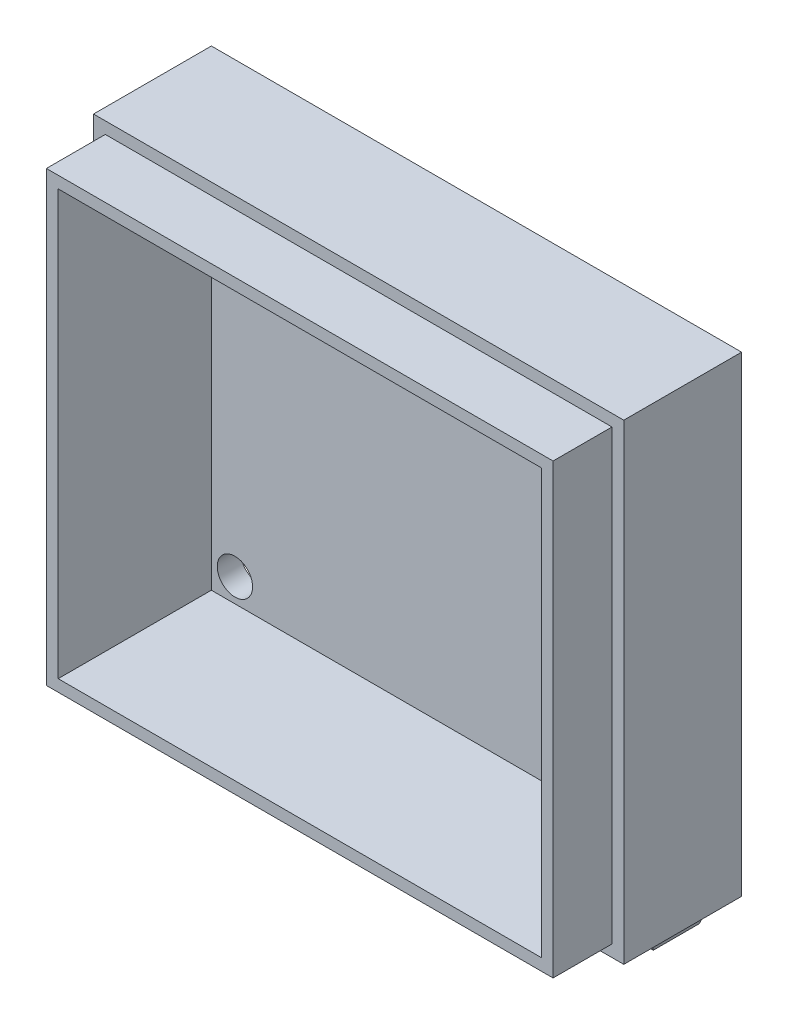
ISO-10303-21;
HEADER;
FILE_DESCRIPTION(('STEP AP214'),'2;1');
FILE_NAME('part.step','',(''),(''),'','','');
FILE_SCHEMA(('AUTOMOTIVE_DESIGN { 1 0 10303 214 1 1 1 1 }'));
ENDSEC;
DATA;
#1=APPLICATION_CONTEXT('core data for automotive mechanical design processes');
#2=APPLICATION_PROTOCOL_DEFINITION('international standard','automotive_design',2000,#1);
#3=PRODUCT_CONTEXT('',#1,'mechanical');
#4=PRODUCT('Part','Part','',(#3));
#5=PRODUCT_RELATED_PRODUCT_CATEGORY('part','',(#4));
#6=PRODUCT_DEFINITION_FORMATION('','',#4);
#7=PRODUCT_DEFINITION_CONTEXT('part definition',#1,'design');
#8=PRODUCT_DEFINITION('design','',#6,#7);
#9=PRODUCT_DEFINITION_SHAPE('','',#8);
#10=(LENGTH_UNIT() NAMED_UNIT(*) SI_UNIT(.MILLI.,.METRE.));
#11=(NAMED_UNIT(*) PLANE_ANGLE_UNIT() SI_UNIT($,.RADIAN.));
#12=(NAMED_UNIT(*) SI_UNIT($,.STERADIAN.) SOLID_ANGLE_UNIT());
#13=UNCERTAINTY_MEASURE_WITH_UNIT(LENGTH_MEASURE(1.E-05),#10,'distance_accuracy_value','');
#14=(GEOMETRIC_REPRESENTATION_CONTEXT(3) GLOBAL_UNCERTAINTY_ASSIGNED_CONTEXT((#13)) GLOBAL_UNIT_ASSIGNED_CONTEXT((#10,
#11,#12)) REPRESENTATION_CONTEXT('',''));
#15=CARTESIAN_POINT('',(0.,0.,0.));
#16=DIRECTION('',(0.,0.,1.));
#17=DIRECTION('',(1.,0.,0.));
#18=AXIS2_PLACEMENT_3D('',#15,#16,#17);
#19=CARTESIAN_POINT('',(-45.,-40.,30.));
#20=DIRECTION('',(0.,1.,0.));
#21=DIRECTION('',(0.,0.,1.));
#22=AXIS2_PLACEMENT_3D('',#19,#20,#21);
#23=PLANE('',#22);
#24=DIRECTION('',(0.,0.,-1.));
#25=VECTOR('',#24,1.);
#26=CARTESIAN_POINT('',(-42.5,-40.,12.5));
#27=LINE('',#26,#25);
#28=CARTESIAN_POINT('',(-42.5,-40.,12.5));
#29=VERTEX_POINT('',#28);
#30=CARTESIAN_POINT('',(-42.5,-40.,2.5));
#31=VERTEX_POINT('',#30);
#32=EDGE_CURVE('E254',#29,#31,#27,.T.);
#33=ORIENTED_EDGE('',*,*,#32,.F.);
#34=DIRECTION('',(-1.,0.,0.));
#35=VECTOR('',#34,1.);
#36=CARTESIAN_POINT('',(-42.5,-40.,12.5));
#37=LINE('',#36,#35);
#38=CARTESIAN_POINT('',(-35.5,-40.,12.5));
#39=VERTEX_POINT('',#38);
#40=EDGE_CURVE('E267',#39,#29,#37,.T.);
#41=ORIENTED_EDGE('',*,*,#40,.F.);
#42=DIRECTION('',(0.,0.,1.));
#43=VECTOR('',#42,1.);
#44=CARTESIAN_POINT('',(-35.5,-40.,12.5));
#45=LINE('',#44,#43);
#46=CARTESIAN_POINT('',(-35.5,-40.,2.5));
#47=VERTEX_POINT('',#46);
#48=EDGE_CURVE('E263',#47,#39,#45,.T.);
#49=ORIENTED_EDGE('',*,*,#48,.F.);
#50=DIRECTION('',(1.,0.,0.));
#51=VECTOR('',#50,1.);
#52=CARTESIAN_POINT('',(-42.5,-40.,2.5));
#53=LINE('',#52,#51);
#54=EDGE_CURVE('E258',#31,#47,#53,.T.);
#55=ORIENTED_EDGE('',*,*,#54,.F.);
#56=EDGE_LOOP('',(#33,#41,#49,#55));
#57=FACE_BOUND('',#56,.T.);
#58=DIRECTION('',(0.,0.,-1.));
#59=VECTOR('',#58,1.);
#60=CARTESIAN_POINT('',(35.5,-40.,12.5));
#61=LINE('',#60,#59);
#62=CARTESIAN_POINT('',(35.5,-40.,12.5));
#63=VERTEX_POINT('',#62);
#64=CARTESIAN_POINT('',(35.5,-40.,2.5));
#65=VERTEX_POINT('',#64);
#66=EDGE_CURVE('E259',#63,#65,#61,.T.);
#67=ORIENTED_EDGE('',*,*,#66,.F.);
#68=DIRECTION('',(-1.,0.,0.));
#69=VECTOR('',#68,1.);
#70=CARTESIAN_POINT('',(35.5,-40.,12.5));
#71=LINE('',#70,#69);
#72=CARTESIAN_POINT('',(42.5,-40.,12.5));
#73=VERTEX_POINT('',#72);
#74=EDGE_CURVE('E315',#73,#63,#71,.T.);
#75=ORIENTED_EDGE('',*,*,#74,.F.);
#76=DIRECTION('',(0.,0.,1.));
#77=VECTOR('',#76,1.);
#78=CARTESIAN_POINT('',(42.5,-40.,12.5));
#79=LINE('',#78,#77);
#80=CARTESIAN_POINT('',(42.5,-40.,2.5));
#81=VERTEX_POINT('',#80);
#82=EDGE_CURVE('E333',#81,#73,#79,.T.);
#83=ORIENTED_EDGE('',*,*,#82,.F.);
#84=DIRECTION('',(1.,0.,0.));
#85=VECTOR('',#84,1.);
#86=CARTESIAN_POINT('',(35.5,-40.,2.5));
#87=LINE('',#86,#85);
#88=EDGE_CURVE('E337',#65,#81,#87,.T.);
#89=ORIENTED_EDGE('',*,*,#88,.F.);
#90=EDGE_LOOP('',(#67,#75,#83,#89));
#91=FACE_BOUND('',#90,.T.);
#92=DIRECTION('',(1.,0.,0.));
#93=VECTOR('',#92,1.);
#94=CARTESIAN_POINT('',(-45.,-40.,20.));
#95=LINE('',#94,#93);
#96=CARTESIAN_POINT('',(-45.,-40.,20.));
#97=VERTEX_POINT('',#96);
#98=CARTESIAN_POINT('',(45.,-40.,20.));
#99=VERTEX_POINT('',#98);
#100=EDGE_CURVE('E229',#97,#99,#95,.T.);
#101=ORIENTED_EDGE('',*,*,#100,.F.);
#102=DIRECTION('',(0.,0.,-1.));
#103=VECTOR('',#102,1.);
#104=CARTESIAN_POINT('',(-45.,-40.,30.));
#105=LINE('',#104,#103);
#106=CARTESIAN_POINT('',(-45.,-40.,0.));
#107=VERTEX_POINT('',#106);
#108=EDGE_CURVE('E404',#97,#107,#105,.T.);
#109=ORIENTED_EDGE('',*,*,#108,.T.);
#110=DIRECTION('',(1.,0.,0.));
#111=VECTOR('',#110,1.);
#112=CARTESIAN_POINT('',(-45.,-40.,0.));
#113=LINE('',#112,#111);
#114=CARTESIAN_POINT('',(45.,-40.,0.));
#115=VERTEX_POINT('',#114);
#116=EDGE_CURVE('E397',#107,#115,#113,.T.);
#117=ORIENTED_EDGE('',*,*,#116,.T.);
#118=DIRECTION('',(0.,0.,-1.));
#119=VECTOR('',#118,1.);
#120=CARTESIAN_POINT('',(45.,-40.,30.));
#121=LINE('',#120,#119);
#122=EDGE_CURVE('E401',#99,#115,#121,.T.);
#123=ORIENTED_EDGE('',*,*,#122,.F.);
#124=EDGE_LOOP('',(#101,#109,#117,#123));
#125=FACE_BOUND('',#124,.T.);
#126=ADVANCED_FACE('F45',(#57,#91,#125),#23,.F.);
#127=CARTESIAN_POINT('',(0.,0.,30.));
#128=DIRECTION('',(0.,0.,-1.));
#129=DIRECTION('',(-1.,0.,0.));
#130=AXIS2_PLACEMENT_3D('',#127,#128,#129);
#131=PLANE('',#130);
#132=DIRECTION('',(0.,1.,0.));
#133=VECTOR('',#132,1.);
#134=CARTESIAN_POINT('',(41.,0.,30.));
#135=LINE('',#134,#133);
#136=CARTESIAN_POINT('',(41.,-36.,30.));
#137=VERTEX_POINT('',#136);
#138=CARTESIAN_POINT('',(41.,36.,30.));
#139=VERTEX_POINT('',#138);
#140=EDGE_CURVE('E374',#137,#139,#135,.T.);
#141=ORIENTED_EDGE('',*,*,#140,.F.);
#142=DIRECTION('',(1.,0.,0.));
#143=VECTOR('',#142,1.);
#144=CARTESIAN_POINT('',(0.,-36.,30.));
#145=LINE('',#144,#143);
#146=CARTESIAN_POINT('',(-41.,-36.,30.));
#147=VERTEX_POINT('',#146);
#148=EDGE_CURVE('E359',#147,#137,#145,.T.);
#149=ORIENTED_EDGE('',*,*,#148,.F.);
#150=DIRECTION('',(0.,-1.,0.));
#151=VECTOR('',#150,1.);
#152=CARTESIAN_POINT('',(-41.,0.,30.));
#153=LINE('',#152,#151);
#154=CARTESIAN_POINT('',(-41.,36.,30.));
#155=VERTEX_POINT('',#154);
#156=EDGE_CURVE('E380',#155,#147,#153,.T.);
#157=ORIENTED_EDGE('',*,*,#156,.F.);
#158=DIRECTION('',(-1.,0.,0.));
#159=VECTOR('',#158,1.);
#160=CARTESIAN_POINT('',(0.,36.,30.));
#161=LINE('',#160,#159);
#162=EDGE_CURVE('E377',#139,#155,#161,.T.);
#163=ORIENTED_EDGE('',*,*,#162,.F.);
#164=EDGE_LOOP('',(#141,#149,#157,#163));
#165=FACE_BOUND('',#164,.T.);
#166=DIRECTION('',(1.,0.,0.));
#167=VECTOR('',#166,1.);
#168=CARTESIAN_POINT('',(-43.,-38.,30.));
#169=LINE('',#168,#167);
#170=CARTESIAN_POINT('',(-43.,-38.,30.));
#171=VERTEX_POINT('',#170);
#172=CARTESIAN_POINT('',(43.,-38.,30.));
#173=VERTEX_POINT('',#172);
#174=EDGE_CURVE('E220',#171,#173,#169,.T.);
#175=ORIENTED_EDGE('',*,*,#174,.T.);
#176=DIRECTION('',(0.,1.,0.));
#177=VECTOR('',#176,1.);
#178=CARTESIAN_POINT('',(43.,-38.,30.));
#179=LINE('',#178,#177);
#180=CARTESIAN_POINT('',(43.,38.,30.));
#181=VERTEX_POINT('',#180);
#182=EDGE_CURVE('E188',#173,#181,#179,.T.);
#183=ORIENTED_EDGE('',*,*,#182,.T.);
#184=DIRECTION('',(-1.,0.,0.));
#185=VECTOR('',#184,1.);
#186=CARTESIAN_POINT('',(43.,38.,30.));
#187=LINE('',#186,#185);
#188=CARTESIAN_POINT('',(-43.,38.,30.));
#189=VERTEX_POINT('',#188);
#190=EDGE_CURVE('E61',#181,#189,#187,.T.);
#191=ORIENTED_EDGE('',*,*,#190,.T.);
#192=DIRECTION('',(0.,-1.,0.));
#193=VECTOR('',#192,1.);
#194=CARTESIAN_POINT('',(-43.,38.,30.));
#195=LINE('',#194,#193);
#196=EDGE_CURVE('E210',#189,#171,#195,.T.);
#197=ORIENTED_EDGE('',*,*,#196,.T.);
#198=EDGE_LOOP('',(#175,#183,#191,#197));
#199=FACE_BOUND('',#198,.T.);
#200=ADVANCED_FACE('F426',(#165,#199),#131,.F.);
#201=CARTESIAN_POINT('',(45.,-40.,30.));
#202=DIRECTION('',(-1.,0.,0.));
#203=DIRECTION('',(0.,0.,1.));
#204=AXIS2_PLACEMENT_3D('',#201,#202,#203);
#205=PLANE('',#204);
#206=DIRECTION('',(0.,1.,0.));
#207=VECTOR('',#206,1.);
#208=CARTESIAN_POINT('',(45.,-40.,20.));
#209=LINE('',#208,#207);
#210=CARTESIAN_POINT('',(45.,40.,20.));
#211=VERTEX_POINT('',#210);
#212=EDGE_CURVE('E237',#99,#211,#209,.T.);
#213=ORIENTED_EDGE('',*,*,#212,.F.);
#214=ORIENTED_EDGE('',*,*,#122,.T.);
#215=DIRECTION('',(0.,1.,0.));
#216=VECTOR('',#215,1.);
#217=CARTESIAN_POINT('',(45.,-40.,0.));
#218=LINE('',#217,#216);
#219=CARTESIAN_POINT('',(45.,40.,0.));
#220=VERTEX_POINT('',#219);
#221=EDGE_CURVE('E352',#115,#220,#218,.T.);
#222=ORIENTED_EDGE('',*,*,#221,.T.);
#223=DIRECTION('',(0.,0.,-1.));
#224=VECTOR('',#223,1.);
#225=CARTESIAN_POINT('',(45.,40.,30.));
#226=LINE('',#225,#224);
#227=EDGE_CURVE('E11',#211,#220,#226,.T.);
#228=ORIENTED_EDGE('',*,*,#227,.F.);
#229=EDGE_LOOP('',(#213,#214,#222,#228));
#230=FACE_BOUND('',#229,.T.);
#231=ADVANCED_FACE('F47',(#230),#205,.F.);
#232=CARTESIAN_POINT('',(-45.,40.,30.));
#233=DIRECTION('',(0.,-1.,0.));
#234=DIRECTION('',(0.,0.,-1.));
#235=AXIS2_PLACEMENT_3D('',#232,#233,#234);
#236=PLANE('',#235);
#237=DIRECTION('',(-1.,0.,0.));
#238=VECTOR('',#237,1.);
#239=CARTESIAN_POINT('',(45.,40.,20.));
#240=LINE('',#239,#238);
#241=CARTESIAN_POINT('',(-45.,40.,20.));
#242=VERTEX_POINT('',#241);
#243=EDGE_CURVE('E69',#211,#242,#240,.T.);
#244=ORIENTED_EDGE('',*,*,#243,.F.);
#245=ORIENTED_EDGE('',*,*,#227,.T.);
#246=DIRECTION('',(-1.,0.,0.));
#247=VECTOR('',#246,1.);
#248=CARTESIAN_POINT('',(-45.,40.,0.));
#249=LINE('',#248,#247);
#250=CARTESIAN_POINT('',(-45.,40.,0.));
#251=VERTEX_POINT('',#250);
#252=EDGE_CURVE('E389',#220,#251,#249,.T.);
#253=ORIENTED_EDGE('',*,*,#252,.T.);
#254=DIRECTION('',(0.,0.,-1.));
#255=VECTOR('',#254,1.);
#256=CARTESIAN_POINT('',(-45.,40.,30.));
#257=LINE('',#256,#255);
#258=EDGE_CURVE('E54',#242,#251,#257,.T.);
#259=ORIENTED_EDGE('',*,*,#258,.F.);
#260=EDGE_LOOP('',(#244,#245,#253,#259));
#261=FACE_BOUND('',#260,.T.);
#262=ADVANCED_FACE('F415',(#261),#236,.F.);
#263=CARTESIAN_POINT('',(-45.,-40.,30.));
#264=DIRECTION('',(1.,0.,0.));
#265=DIRECTION('',(0.,0.,-1.));
#266=AXIS2_PLACEMENT_3D('',#263,#264,#265);
#267=PLANE('',#266);
#268=DIRECTION('',(0.,-1.,0.));
#269=VECTOR('',#268,1.);
#270=CARTESIAN_POINT('',(-45.,40.,20.));
#271=LINE('',#270,#269);
#272=EDGE_CURVE('E242',#242,#97,#271,.T.);
#273=ORIENTED_EDGE('',*,*,#272,.F.);
#274=ORIENTED_EDGE('',*,*,#258,.T.);
#275=DIRECTION('',(0.,-1.,0.));
#276=VECTOR('',#275,1.);
#277=CARTESIAN_POINT('',(-45.,-40.,0.));
#278=LINE('',#277,#276);
#279=EDGE_CURVE('E393',#251,#107,#278,.T.);
#280=ORIENTED_EDGE('',*,*,#279,.T.);
#281=ORIENTED_EDGE('',*,*,#108,.F.);
#282=EDGE_LOOP('',(#273,#274,#280,#281));
#283=FACE_BOUND('',#282,.T.);
#284=ADVANCED_FACE('F409',(#283),#267,.F.);
#285=CARTESIAN_POINT('',(0.,0.,0.));
#286=DIRECTION('',(0.,0.,-1.));
#287=DIRECTION('',(-1.,0.,0.));
#288=AXIS2_PLACEMENT_3D('',#285,#286,#287);
#289=PLANE('',#288);
#290=CARTESIAN_POINT('',(-37.,-32.,0.));
#291=DIRECTION('',(0.,0.,-1.));
#292=DIRECTION('',(-1.,0.,0.));
#293=AXIS2_PLACEMENT_3D('',#290,#291,#292);
#294=CIRCLE('',#293,3.);
#295=CARTESIAN_POINT('',(-40.,-32.,0.));
#296=VERTEX_POINT('',#295);
#297=EDGE_CURVE('E249',#296,#296,#294,.T.);
#298=ORIENTED_EDGE('',*,*,#297,.F.);
#299=EDGE_LOOP('',(#298));
#300=FACE_BOUND('',#299,.T.);
#301=ORIENTED_EDGE('',*,*,#221,.F.);
#302=ORIENTED_EDGE('',*,*,#116,.F.);
#303=ORIENTED_EDGE('',*,*,#279,.F.);
#304=ORIENTED_EDGE('',*,*,#252,.F.);
#305=EDGE_LOOP('',(#301,#302,#303,#304));
#306=FACE_BOUND('',#305,.T.);
#307=ADVANCED_FACE('F419',(#300,#306),#289,.T.);
#308=CARTESIAN_POINT('',(41.,-40.,30.));
#309=DIRECTION('',(-1.,0.,0.));
#310=DIRECTION('',(0.,0.,1.));
#311=AXIS2_PLACEMENT_3D('',#308,#309,#310);
#312=PLANE('',#311);
#313=DIRECTION('',(0.,1.,0.));
#314=VECTOR('',#313,1.);
#315=CARTESIAN_POINT('',(41.,0.,4.));
#316=LINE('',#315,#314);
#317=CARTESIAN_POINT('',(41.,-36.,4.));
#318=VERTEX_POINT('',#317);
#319=CARTESIAN_POINT('',(41.,36.,4.));
#320=VERTEX_POINT('',#319);
#321=EDGE_CURVE('E276',#318,#320,#316,.T.);
#322=ORIENTED_EDGE('',*,*,#321,.F.);
#323=DIRECTION('',(0.,0.,-1.));
#324=VECTOR('',#323,1.);
#325=CARTESIAN_POINT('',(41.,-36.,30.));
#326=LINE('',#325,#324);
#327=EDGE_CURVE('E354',#137,#318,#326,.T.);
#328=ORIENTED_EDGE('',*,*,#327,.F.);
#329=ORIENTED_EDGE('',*,*,#140,.T.);
#330=DIRECTION('',(0.,0.,-1.));
#331=VECTOR('',#330,1.);
#332=CARTESIAN_POINT('',(41.,36.,30.));
#333=LINE('',#332,#331);
#334=EDGE_CURVE('E348',#139,#320,#333,.T.);
#335=ORIENTED_EDGE('',*,*,#334,.T.);
#336=EDGE_LOOP('',(#322,#328,#329,#335));
#337=FACE_BOUND('',#336,.T.);
#338=ADVANCED_FACE('F447',(#337),#312,.T.);
#339=CARTESIAN_POINT('',(-45.,36.,30.));
#340=DIRECTION('',(0.,-1.,0.));
#341=DIRECTION('',(0.,0.,-1.));
#342=AXIS2_PLACEMENT_3D('',#339,#340,#341);
#343=PLANE('',#342);
#344=DIRECTION('',(-1.,0.,0.));
#345=VECTOR('',#344,1.);
#346=CARTESIAN_POINT('',(0.,36.,4.));
#347=LINE('',#346,#345);
#348=CARTESIAN_POINT('',(-41.,36.,4.));
#349=VERTEX_POINT('',#348);
#350=EDGE_CURVE('E347',#320,#349,#347,.T.);
#351=ORIENTED_EDGE('',*,*,#350,.F.);
#352=ORIENTED_EDGE('',*,*,#334,.F.);
#353=ORIENTED_EDGE('',*,*,#162,.T.);
#354=DIRECTION('',(0.,0.,-1.));
#355=VECTOR('',#354,1.);
#356=CARTESIAN_POINT('',(-41.,36.,30.));
#357=LINE('',#356,#355);
#358=EDGE_CURVE('E353',#155,#349,#357,.T.);
#359=ORIENTED_EDGE('',*,*,#358,.T.);
#360=EDGE_LOOP('',(#351,#352,#353,#359));
#361=FACE_BOUND('',#360,.T.);
#362=ADVANCED_FACE('F454',(#361),#343,.T.);
#363=CARTESIAN_POINT('',(-41.,-40.,30.));
#364=DIRECTION('',(1.,0.,0.));
#365=DIRECTION('',(0.,0.,-1.));
#366=AXIS2_PLACEMENT_3D('',#363,#364,#365);
#367=PLANE('',#366);
#368=DIRECTION('',(0.,-1.,0.));
#369=VECTOR('',#368,1.);
#370=CARTESIAN_POINT('',(-41.,0.,4.));
#371=LINE('',#370,#369);
#372=CARTESIAN_POINT('',(-41.,-36.,4.));
#373=VERTEX_POINT('',#372);
#374=EDGE_CURVE('E362',#349,#373,#371,.T.);
#375=ORIENTED_EDGE('',*,*,#374,.F.);
#376=ORIENTED_EDGE('',*,*,#358,.F.);
#377=ORIENTED_EDGE('',*,*,#156,.T.);
#378=DIRECTION('',(0.,0.,-1.));
#379=VECTOR('',#378,1.);
#380=CARTESIAN_POINT('',(-41.,-36.,30.));
#381=LINE('',#380,#379);
#382=EDGE_CURVE('E358',#147,#373,#381,.T.);
#383=ORIENTED_EDGE('',*,*,#382,.T.);
#384=EDGE_LOOP('',(#375,#376,#377,#383));
#385=FACE_BOUND('',#384,.T.);
#386=ADVANCED_FACE('F483',(#385),#367,.T.);
#387=CARTESIAN_POINT('',(-45.,-36.,30.));
#388=DIRECTION('',(0.,1.,0.));
#389=DIRECTION('',(0.,0.,1.));
#390=AXIS2_PLACEMENT_3D('',#387,#388,#389);
#391=PLANE('',#390);
#392=DIRECTION('',(1.,0.,0.));
#393=VECTOR('',#392,1.);
#394=CARTESIAN_POINT('',(0.,-36.,4.));
#395=LINE('',#394,#393);
#396=EDGE_CURVE('E368',#373,#318,#395,.T.);
#397=ORIENTED_EDGE('',*,*,#396,.F.);
#398=ORIENTED_EDGE('',*,*,#382,.F.);
#399=ORIENTED_EDGE('',*,*,#148,.T.);
#400=ORIENTED_EDGE('',*,*,#327,.T.);
#401=EDGE_LOOP('',(#397,#398,#399,#400));
#402=FACE_BOUND('',#401,.T.);
#403=ADVANCED_FACE('F468',(#402),#391,.T.);
#404=CARTESIAN_POINT('',(0.,0.,4.));
#405=DIRECTION('',(0.,0.,-1.));
#406=DIRECTION('',(-1.,0.,0.));
#407=AXIS2_PLACEMENT_3D('',#404,#405,#406);
#408=PLANE('',#407);
#409=CARTESIAN_POINT('',(-37.,-32.,4.));
#410=DIRECTION('',(0.,0.,1.));
#411=DIRECTION('',(1.,0.,0.));
#412=AXIS2_PLACEMENT_3D('',#409,#410,#411);
#413=CIRCLE('',#412,3.);
#414=CARTESIAN_POINT('',(-34.,-32.,4.));
#415=VERTEX_POINT('',#414);
#416=EDGE_CURVE('E245',#415,#415,#413,.T.);
#417=ORIENTED_EDGE('',*,*,#416,.F.);
#418=EDGE_LOOP('',(#417));
#419=FACE_BOUND('',#418,.T.);
#420=ORIENTED_EDGE('',*,*,#321,.T.);
#421=ORIENTED_EDGE('',*,*,#350,.T.);
#422=ORIENTED_EDGE('',*,*,#374,.T.);
#423=ORIENTED_EDGE('',*,*,#396,.T.);
#424=EDGE_LOOP('',(#420,#421,#422,#423));
#425=FACE_BOUND('',#424,.T.);
#426=ADVANCED_FACE('F465',(#419,#425),#408,.F.);
#427=CARTESIAN_POINT('',(35.5,-40.,12.5));
#428=DIRECTION('',(-0.965925826289068,-0.258819045102521,0.));
#429=DIRECTION('',(0.258819045102521,-0.965925826289068,0.));
#430=AXIS2_PLACEMENT_3D('',#427,#428,#429);
#431=PLANE('',#430);
#432=ORIENTED_EDGE('',*,*,#66,.T.);
#433=DIRECTION('',(-0.250562807085732,0.935113126531029,-0.250562807085732));
#434=VECTOR('',#433,1.);
#435=CARTESIAN_POINT('',(35.5,-40.,2.5));
#436=LINE('',#435,#434);
#437=CARTESIAN_POINT('',(36.5717967697245,-44.,3.57179676972449));
#438=VERTEX_POINT('',#437);
#439=EDGE_CURVE('E253',#438,#65,#436,.T.);
#440=ORIENTED_EDGE('',*,*,#439,.F.);
#441=DIRECTION('',(0.,0.,1.));
#442=VECTOR('',#441,1.);
#443=CARTESIAN_POINT('',(36.5717967697245,-44.,12.5));
#444=LINE('',#443,#442);
#445=CARTESIAN_POINT('',(36.5717967697245,-44.,11.4282032302755));
#446=VERTEX_POINT('',#445);
#447=EDGE_CURVE('E311',#446,#438,#444,.F.);
#448=ORIENTED_EDGE('',*,*,#447,.F.);
#449=DIRECTION('',(-0.250562807085732,0.935113126531029,0.250562807085732));
#450=VECTOR('',#449,1.);
#451=CARTESIAN_POINT('',(35.5,-40.,12.5));
#452=LINE('',#451,#450);
#453=EDGE_CURVE('E305',#446,#63,#452,.T.);
#454=ORIENTED_EDGE('',*,*,#453,.T.);
#455=EDGE_LOOP('',(#432,#440,#448,#454));
#456=FACE_BOUND('',#455,.T.);
#457=ADVANCED_FACE('F467',(#456),#431,.T.);
#458=CARTESIAN_POINT('',(35.5,-40.,2.5));
#459=DIRECTION('',(0.,-0.258819045102521,-0.965925826289068));
#460=DIRECTION('',(0.,0.965925826289068,-0.258819045102521));
#461=AXIS2_PLACEMENT_3D('',#458,#459,#460);
#462=PLANE('',#461);
#463=ORIENTED_EDGE('',*,*,#88,.T.);
#464=DIRECTION('',(0.250562807085731,0.935113126531029,-0.250562807085732));
#465=VECTOR('',#464,1.);
#466=CARTESIAN_POINT('',(41.8721827970532,-42.3430456992633,3.12781720294682));
#467=LINE('',#466,#465);
#468=CARTESIAN_POINT('',(41.4282032302755,-44.,3.57179676972449));
#469=VERTEX_POINT('',#468);
#470=EDGE_CURVE('E316',#469,#81,#467,.T.);
#471=ORIENTED_EDGE('',*,*,#470,.F.);
#472=DIRECTION('',(-1.,0.,0.));
#473=VECTOR('',#472,1.);
#474=CARTESIAN_POINT('',(35.5,-44.,3.57179676972449));
#475=LINE('',#474,#473);
#476=EDGE_CURVE('E308',#438,#469,#475,.F.);
#477=ORIENTED_EDGE('',*,*,#476,.F.);
#478=ORIENTED_EDGE('',*,*,#439,.T.);
#479=EDGE_LOOP('',(#463,#471,#477,#478));
#480=FACE_BOUND('',#479,.T.);
#481=ADVANCED_FACE('F502',(#480),#462,.T.);
#482=CARTESIAN_POINT('',(42.5,-40.,12.5));
#483=DIRECTION('',(0.965925826289068,-0.258819045102521,0.));
#484=DIRECTION('',(0.258819045102521,0.965925826289068,0.));
#485=AXIS2_PLACEMENT_3D('',#482,#483,#484);
#486=PLANE('',#485);
#487=ORIENTED_EDGE('',*,*,#82,.T.);
#488=DIRECTION('',(0.250562807085732,0.935113126531029,0.250562807085732));
#489=VECTOR('',#488,1.);
#490=CARTESIAN_POINT('',(42.0605279579372,-41.6401319894843,12.0605279579372));
#491=LINE('',#490,#489);
#492=CARTESIAN_POINT('',(41.4282032302755,-44.,11.4282032302755));
#493=VERTEX_POINT('',#492);
#494=EDGE_CURVE('E320',#493,#73,#491,.T.);
#495=ORIENTED_EDGE('',*,*,#494,.F.);
#496=DIRECTION('',(0.,0.,-1.));
#497=VECTOR('',#496,1.);
#498=CARTESIAN_POINT('',(41.4282032302755,-44.,12.5));
#499=LINE('',#498,#497);
#500=EDGE_CURVE('E304',#469,#493,#499,.F.);
#501=ORIENTED_EDGE('',*,*,#500,.F.);
#502=ORIENTED_EDGE('',*,*,#470,.T.);
#503=EDGE_LOOP('',(#487,#495,#501,#502));
#504=FACE_BOUND('',#503,.T.);
#505=ADVANCED_FACE('F506',(#504),#486,.T.);
#506=CARTESIAN_POINT('',(35.5,-40.,12.5));
#507=DIRECTION('',(0.,-0.258819045102521,0.965925826289068));
#508=DIRECTION('',(0.,-0.965925826289068,-0.258819045102521));
#509=AXIS2_PLACEMENT_3D('',#506,#507,#508);
#510=PLANE('',#509);
#511=ORIENTED_EDGE('',*,*,#74,.T.);
#512=ORIENTED_EDGE('',*,*,#453,.F.);
#513=DIRECTION('',(1.,0.,0.));
#514=VECTOR('',#513,1.);
#515=CARTESIAN_POINT('',(35.5,-44.,11.4282032302755));
#516=LINE('',#515,#514);
#517=EDGE_CURVE('E301',#493,#446,#516,.F.);
#518=ORIENTED_EDGE('',*,*,#517,.F.);
#519=ORIENTED_EDGE('',*,*,#494,.T.);
#520=EDGE_LOOP('',(#511,#512,#518,#519));
#521=FACE_BOUND('',#520,.T.);
#522=ADVANCED_FACE('F499',(#521),#510,.T.);
#523=CARTESIAN_POINT('',(0.,-44.,0.));
#524=DIRECTION('',(0.,-1.,0.));
#525=DIRECTION('',(0.,0.,-1.));
#526=AXIS2_PLACEMENT_3D('',#523,#524,#525);
#527=PLANE('',#526);
#528=ORIENTED_EDGE('',*,*,#447,.T.);
#529=ORIENTED_EDGE('',*,*,#476,.T.);
#530=ORIENTED_EDGE('',*,*,#500,.T.);
#531=ORIENTED_EDGE('',*,*,#517,.T.);
#532=EDGE_LOOP('',(#528,#529,#530,#531));
#533=FACE_BOUND('',#532,.T.);
#534=ADVANCED_FACE('F495',(#533),#527,.T.);
#535=CARTESIAN_POINT('',(-42.5,-40.,12.5));
#536=DIRECTION('',(-0.965925826289068,-0.258819045102521,0.));
#537=DIRECTION('',(0.258819045102521,-0.965925826289068,0.));
#538=AXIS2_PLACEMENT_3D('',#535,#536,#537);
#539=PLANE('',#538);
#540=ORIENTED_EDGE('',*,*,#32,.T.);
#541=DIRECTION('',(-0.250562807085732,0.935113126531029,-0.250562807085732));
#542=VECTOR('',#541,1.);
#543=CARTESIAN_POINT('',(-42.5,-40.,2.5));
#544=LINE('',#543,#542);
#545=CARTESIAN_POINT('',(-41.4282032302755,-44.,3.57179676972449));
#546=VERTEX_POINT('',#545);
#547=EDGE_CURVE('E272',#546,#31,#544,.T.);
#548=ORIENTED_EDGE('',*,*,#547,.F.);
#549=DIRECTION('',(0.,0.,1.));
#550=VECTOR('',#549,1.);
#551=CARTESIAN_POINT('',(-41.4282032302755,-44.,12.5));
#552=LINE('',#551,#550);
#553=CARTESIAN_POINT('',(-41.4282032302755,-44.,11.4282032302755));
#554=VERTEX_POINT('',#553);
#555=EDGE_CURVE('E271',#554,#546,#552,.F.);
#556=ORIENTED_EDGE('',*,*,#555,.F.);
#557=DIRECTION('',(-0.250562807085732,0.935113126531029,0.250562807085732));
#558=VECTOR('',#557,1.);
#559=CARTESIAN_POINT('',(-42.5,-40.,12.5));
#560=LINE('',#559,#558);
#561=EDGE_CURVE('E278',#554,#29,#560,.T.);
#562=ORIENTED_EDGE('',*,*,#561,.T.);
#563=EDGE_LOOP('',(#540,#548,#556,#562));
#564=FACE_BOUND('',#563,.T.);
#565=ADVANCED_FACE('F498',(#564),#539,.T.);
#566=CARTESIAN_POINT('',(-42.5,-40.,2.5));
#567=DIRECTION('',(0.,-0.258819045102521,-0.965925826289068));
#568=DIRECTION('',(0.,0.965925826289068,-0.258819045102521));
#569=AXIS2_PLACEMENT_3D('',#566,#567,#568);
#570=PLANE('',#569);
#571=ORIENTED_EDGE('',*,*,#54,.T.);
#572=DIRECTION('',(0.250562807085732,0.935113126531029,-0.250562807085732));
#573=VECTOR('',#572,1.);
#574=CARTESIAN_POINT('',(-36.1278172029468,-42.3430456992633,3.12781720294682));
#575=LINE('',#574,#573);
#576=CARTESIAN_POINT('',(-36.5717967697245,-44.,3.57179676972449));
#577=VERTEX_POINT('',#576);
#578=EDGE_CURVE('E277',#577,#47,#575,.T.);
#579=ORIENTED_EDGE('',*,*,#578,.F.);
#580=DIRECTION('',(-1.,0.,0.));
#581=VECTOR('',#580,1.);
#582=CARTESIAN_POINT('',(-42.5,-44.,3.57179676972449));
#583=LINE('',#582,#581);
#584=EDGE_CURVE('E293',#546,#577,#583,.F.);
#585=ORIENTED_EDGE('',*,*,#584,.F.);
#586=ORIENTED_EDGE('',*,*,#547,.T.);
#587=EDGE_LOOP('',(#571,#579,#585,#586));
#588=FACE_BOUND('',#587,.T.);
#589=ADVANCED_FACE('F514',(#588),#570,.T.);
#590=CARTESIAN_POINT('',(-35.5,-40.,12.5));
#591=DIRECTION('',(0.965925826289068,-0.258819045102521,0.));
#592=DIRECTION('',(0.258819045102521,0.965925826289068,0.));
#593=AXIS2_PLACEMENT_3D('',#590,#591,#592);
#594=PLANE('',#593);
#595=ORIENTED_EDGE('',*,*,#48,.T.);
#596=DIRECTION('',(0.250562807085732,0.935113126531029,0.250562807085732));
#597=VECTOR('',#596,1.);
#598=CARTESIAN_POINT('',(-35.9394720420628,-41.6401319894843,12.0605279579372));
#599=LINE('',#598,#597);
#600=CARTESIAN_POINT('',(-36.5717967697245,-44.,11.4282032302755));
#601=VERTEX_POINT('',#600);
#602=EDGE_CURVE('E282',#601,#39,#599,.T.);
#603=ORIENTED_EDGE('',*,*,#602,.F.);
#604=DIRECTION('',(0.,0.,-1.));
#605=VECTOR('',#604,1.);
#606=CARTESIAN_POINT('',(-36.5717967697245,-44.,12.5));
#607=LINE('',#606,#605);
#608=EDGE_CURVE('E296',#577,#601,#607,.F.);
#609=ORIENTED_EDGE('',*,*,#608,.F.);
#610=ORIENTED_EDGE('',*,*,#578,.T.);
#611=EDGE_LOOP('',(#595,#603,#609,#610));
#612=FACE_BOUND('',#611,.T.);
#613=ADVANCED_FACE('F517',(#612),#594,.T.);
#614=CARTESIAN_POINT('',(-42.5,-40.,12.5));
#615=DIRECTION('',(0.,-0.258819045102521,0.965925826289068));
#616=DIRECTION('',(0.,-0.965925826289068,-0.258819045102521));
#617=AXIS2_PLACEMENT_3D('',#614,#615,#616);
#618=PLANE('',#617);
#619=ORIENTED_EDGE('',*,*,#40,.T.);
#620=ORIENTED_EDGE('',*,*,#561,.F.);
#621=DIRECTION('',(1.,0.,0.));
#622=VECTOR('',#621,1.);
#623=CARTESIAN_POINT('',(-42.5,-44.,11.4282032302755));
#624=LINE('',#623,#622);
#625=EDGE_CURVE('E283',#601,#554,#624,.F.);
#626=ORIENTED_EDGE('',*,*,#625,.F.);
#627=ORIENTED_EDGE('',*,*,#602,.T.);
#628=EDGE_LOOP('',(#619,#620,#626,#627));
#629=FACE_BOUND('',#628,.T.);
#630=ADVANCED_FACE('F521',(#629),#618,.T.);
#631=CARTESIAN_POINT('',(0.,-44.,0.));
#632=DIRECTION('',(0.,-1.,0.));
#633=DIRECTION('',(0.,0.,-1.));
#634=AXIS2_PLACEMENT_3D('',#631,#632,#633);
#635=PLANE('',#634);
#636=ORIENTED_EDGE('',*,*,#555,.T.);
#637=ORIENTED_EDGE('',*,*,#584,.T.);
#638=ORIENTED_EDGE('',*,*,#608,.T.);
#639=ORIENTED_EDGE('',*,*,#625,.T.);
#640=EDGE_LOOP('',(#636,#637,#638,#639));
#641=FACE_BOUND('',#640,.T.);
#642=ADVANCED_FACE('F461',(#641),#635,.T.);
#643=CARTESIAN_POINT('',(-37.,-32.,-6.));
#644=DIRECTION('',(0.,0.,1.));
#645=DIRECTION('',(1.,0.,0.));
#646=AXIS2_PLACEMENT_3D('',#643,#644,#645);
#647=CYLINDRICAL_SURFACE('',#646,3.);
#648=ORIENTED_EDGE('',*,*,#297,.T.);
#649=EDGE_LOOP('',(#648));
#650=FACE_BOUND('',#649,.T.);
#651=ORIENTED_EDGE('',*,*,#416,.T.);
#652=EDGE_LOOP('',(#651));
#653=FACE_BOUND('',#652,.T.);
#654=ADVANCED_FACE('F459',(#650,#653),#647,.F.);
#655=CARTESIAN_POINT('',(0.,0.,20.));
#656=DIRECTION('',(0.,0.,1.));
#657=DIRECTION('',(1.,0.,0.));
#658=AXIS2_PLACEMENT_3D('',#655,#656,#657);
#659=PLANE('',#658);
#660=DIRECTION('',(0.,-1.,0.));
#661=VECTOR('',#660,1.);
#662=CARTESIAN_POINT('',(-43.,38.,20.));
#663=LINE('',#662,#661);
#664=CARTESIAN_POINT('',(-43.,38.,20.));
#665=VERTEX_POINT('',#664);
#666=CARTESIAN_POINT('',(-43.,-38.,20.));
#667=VERTEX_POINT('',#666);
#668=EDGE_CURVE('E195',#665,#667,#663,.T.);
#669=ORIENTED_EDGE('',*,*,#668,.F.);
#670=DIRECTION('',(-1.,0.,0.));
#671=VECTOR('',#670,1.);
#672=CARTESIAN_POINT('',(43.,38.,20.));
#673=LINE('',#672,#671);
#674=CARTESIAN_POINT('',(43.,38.,20.));
#675=VERTEX_POINT('',#674);
#676=EDGE_CURVE('E204',#675,#665,#673,.T.);
#677=ORIENTED_EDGE('',*,*,#676,.F.);
#678=DIRECTION('',(0.,1.,0.));
#679=VECTOR('',#678,1.);
#680=CARTESIAN_POINT('',(43.,-38.,20.));
#681=LINE('',#680,#679);
#682=CARTESIAN_POINT('',(43.,-38.,20.));
#683=VERTEX_POINT('',#682);
#684=EDGE_CURVE('E186',#683,#675,#681,.T.);
#685=ORIENTED_EDGE('',*,*,#684,.F.);
#686=DIRECTION('',(1.,0.,0.));
#687=VECTOR('',#686,1.);
#688=CARTESIAN_POINT('',(-43.,-38.,20.));
#689=LINE('',#688,#687);
#690=EDGE_CURVE('E201',#667,#683,#689,.T.);
#691=ORIENTED_EDGE('',*,*,#690,.F.);
#692=EDGE_LOOP('',(#669,#677,#685,#691));
#693=FACE_BOUND('',#692,.T.);
#694=ORIENTED_EDGE('',*,*,#100,.T.);
#695=ORIENTED_EDGE('',*,*,#212,.T.);
#696=ORIENTED_EDGE('',*,*,#243,.T.);
#697=ORIENTED_EDGE('',*,*,#272,.T.);
#698=EDGE_LOOP('',(#694,#695,#696,#697));
#699=FACE_BOUND('',#698,.T.);
#700=ADVANCED_FACE('F200',(#693,#699),#659,.T.);
#701=CARTESIAN_POINT('',(-43.,-38.,20.));
#702=DIRECTION('',(0.,-1.,0.));
#703=DIRECTION('',(0.,0.,-1.));
#704=AXIS2_PLACEMENT_3D('',#701,#702,#703);
#705=PLANE('',#704);
#706=ORIENTED_EDGE('',*,*,#174,.F.);
#707=DIRECTION('',(0.,0.,1.));
#708=VECTOR('',#707,1.);
#709=CARTESIAN_POINT('',(-43.,-38.,20.));
#710=LINE('',#709,#708);
#711=EDGE_CURVE('E208',#667,#171,#710,.T.);
#712=ORIENTED_EDGE('',*,*,#711,.F.);
#713=ORIENTED_EDGE('',*,*,#690,.T.);
#714=DIRECTION('',(0.,0.,1.));
#715=VECTOR('',#714,1.);
#716=CARTESIAN_POINT('',(43.,-38.,20.));
#717=LINE('',#716,#715);
#718=EDGE_CURVE('E183',#683,#173,#717,.T.);
#719=ORIENTED_EDGE('',*,*,#718,.T.);
#720=EDGE_LOOP('',(#706,#712,#713,#719));
#721=FACE_BOUND('',#720,.T.);
#722=ADVANCED_FACE('F207',(#721),#705,.T.);
#723=CARTESIAN_POINT('',(-43.,38.,20.));
#724=DIRECTION('',(-1.,0.,0.));
#725=DIRECTION('',(0.,0.,1.));
#726=AXIS2_PLACEMENT_3D('',#723,#724,#725);
#727=PLANE('',#726);
#728=ORIENTED_EDGE('',*,*,#196,.F.);
#729=DIRECTION('',(0.,0.,1.));
#730=VECTOR('',#729,1.);
#731=CARTESIAN_POINT('',(-43.,38.,20.));
#732=LINE('',#731,#730);
#733=EDGE_CURVE('E230',#665,#189,#732,.T.);
#734=ORIENTED_EDGE('',*,*,#733,.F.);
#735=ORIENTED_EDGE('',*,*,#668,.T.);
#736=ORIENTED_EDGE('',*,*,#711,.T.);
#737=EDGE_LOOP('',(#728,#734,#735,#736));
#738=FACE_BOUND('',#737,.T.);
#739=ADVANCED_FACE('F534',(#738),#727,.T.);
#740=CARTESIAN_POINT('',(43.,38.,20.));
#741=DIRECTION('',(0.,1.,0.));
#742=DIRECTION('',(0.,0.,1.));
#743=AXIS2_PLACEMENT_3D('',#740,#741,#742);
#744=PLANE('',#743);
#745=ORIENTED_EDGE('',*,*,#190,.F.);
#746=DIRECTION('',(0.,0.,1.));
#747=VECTOR('',#746,1.);
#748=CARTESIAN_POINT('',(43.,38.,20.));
#749=LINE('',#748,#747);
#750=EDGE_CURVE('E194',#675,#181,#749,.T.);
#751=ORIENTED_EDGE('',*,*,#750,.F.);
#752=ORIENTED_EDGE('',*,*,#676,.T.);
#753=ORIENTED_EDGE('',*,*,#733,.T.);
#754=EDGE_LOOP('',(#745,#751,#752,#753));
#755=FACE_BOUND('',#754,.T.);
#756=ADVANCED_FACE('F537',(#755),#744,.T.);
#757=CARTESIAN_POINT('',(43.,-38.,20.));
#758=DIRECTION('',(1.,0.,0.));
#759=DIRECTION('',(0.,0.,-1.));
#760=AXIS2_PLACEMENT_3D('',#757,#758,#759);
#761=PLANE('',#760);
#762=ORIENTED_EDGE('',*,*,#182,.F.);
#763=ORIENTED_EDGE('',*,*,#718,.F.);
#764=ORIENTED_EDGE('',*,*,#684,.T.);
#765=ORIENTED_EDGE('',*,*,#750,.T.);
#766=EDGE_LOOP('',(#762,#763,#764,#765));
#767=FACE_BOUND('',#766,.T.);
#768=ADVANCED_FACE('F185',(#767),#761,.T.);
#769=CLOSED_SHELL('',(#126,#200,#231,#262,#284,#307,#338,#362,#386,#403,#426,#457,#481,#505,
#522,#534,#565,#589,#613,#630,#642,#654,#700,#722,#739,#756,#768));
#770=MANIFOLD_SOLID_BREP('B2',#769);
#771=ADVANCED_BREP_SHAPE_REPRESENTATION('',(#18,#770),#14);
#772=SHAPE_DEFINITION_REPRESENTATION(#9,#771);
ENDSEC;
END-ISO-10303-21;
